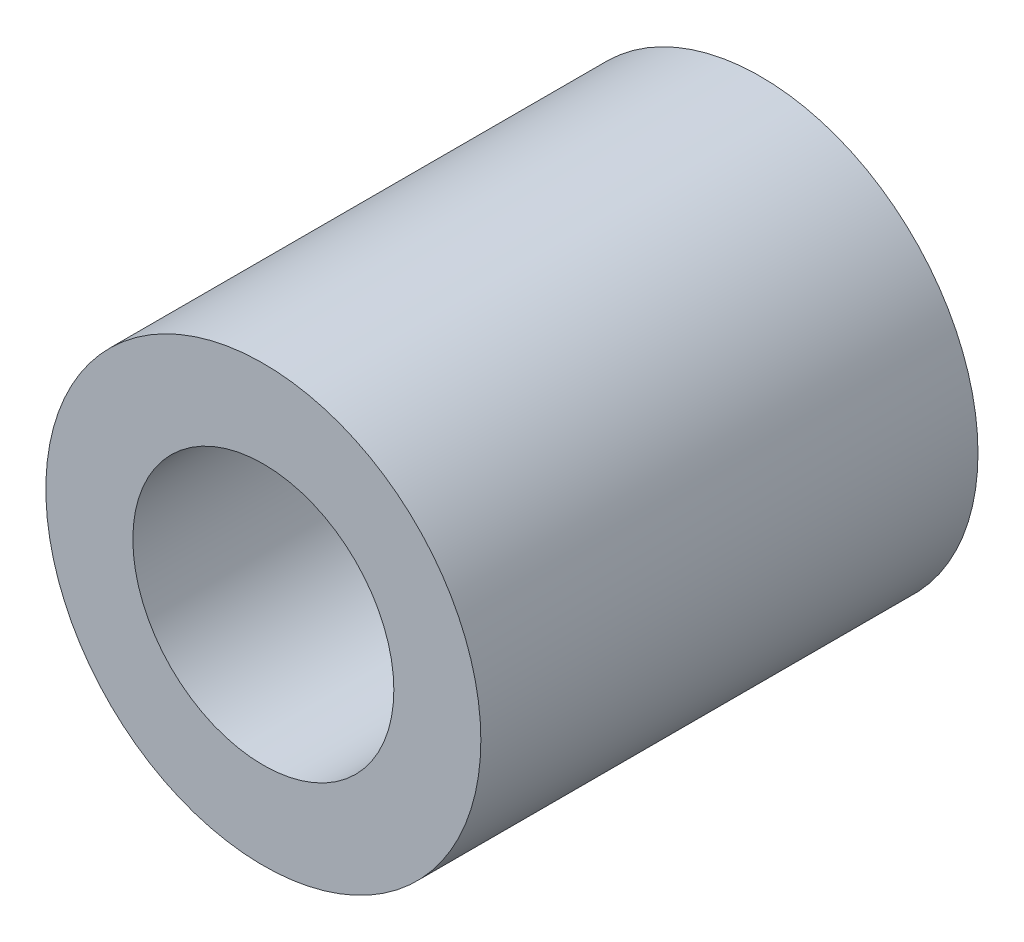
ISO-10303-21;
HEADER;
FILE_DESCRIPTION(('STEP AP214'),'2;1');
FILE_NAME('part.step','',(''),(''),'','','');
FILE_SCHEMA(('AUTOMOTIVE_DESIGN { 1 0 10303 214 1 1 1 1 }'));
ENDSEC;
DATA;
#1=APPLICATION_CONTEXT('core data for automotive mechanical design processes');
#2=APPLICATION_PROTOCOL_DEFINITION('international standard','automotive_design',2000,#1);
#3=PRODUCT_CONTEXT('',#1,'mechanical');
#4=PRODUCT('Part','Part','',(#3));
#5=PRODUCT_RELATED_PRODUCT_CATEGORY('part','',(#4));
#6=PRODUCT_DEFINITION_FORMATION('','',#4);
#7=PRODUCT_DEFINITION_CONTEXT('part definition',#1,'design');
#8=PRODUCT_DEFINITION('design','',#6,#7);
#9=PRODUCT_DEFINITION_SHAPE('','',#8);
#10=(LENGTH_UNIT() NAMED_UNIT(*) SI_UNIT(.MILLI.,.METRE.));
#11=(NAMED_UNIT(*) PLANE_ANGLE_UNIT() SI_UNIT($,.RADIAN.));
#12=(NAMED_UNIT(*) SI_UNIT($,.STERADIAN.) SOLID_ANGLE_UNIT());
#13=UNCERTAINTY_MEASURE_WITH_UNIT(LENGTH_MEASURE(1.E-05),#10,'distance_accuracy_value','');
#14=(GEOMETRIC_REPRESENTATION_CONTEXT(3) GLOBAL_UNCERTAINTY_ASSIGNED_CONTEXT((#13)) GLOBAL_UNIT_ASSIGNED_CONTEXT((#10,
#11,#12)) REPRESENTATION_CONTEXT('',''));
#15=CARTESIAN_POINT('',(0.,0.,0.));
#16=DIRECTION('',(0.,0.,1.));
#17=DIRECTION('',(1.,0.,0.));
#18=AXIS2_PLACEMENT_3D('',#15,#16,#17);
#19=CARTESIAN_POINT('',(0.,0.,8.));
#20=DIRECTION('',(0.,0.,1.));
#21=DIRECTION('',(1.,0.,0.));
#22=AXIS2_PLACEMENT_3D('',#19,#20,#21);
#23=PLANE('',#22);
#24=CARTESIAN_POINT('',(0.,0.,8.));
#25=DIRECTION('',(0.,0.,1.));
#26=DIRECTION('',(1.,0.,0.));
#27=AXIS2_PLACEMENT_3D('',#24,#25,#26);
#28=CIRCLE('',#27,3.5);
#29=CARTESIAN_POINT('',(3.5,0.,8.));
#30=VERTEX_POINT('',#29);
#31=EDGE_CURVE('E10',#30,#30,#28,.T.);
#32=ORIENTED_EDGE('',*,*,#31,.T.);
#33=EDGE_LOOP('',(#32));
#34=FACE_BOUND('',#33,.T.);
#35=CARTESIAN_POINT('',(0.,0.,8.));
#36=DIRECTION('',(0.,0.,1.));
#37=DIRECTION('',(1.,0.,0.));
#38=AXIS2_PLACEMENT_3D('',#35,#36,#37);
#39=CIRCLE('',#38,2.1);
#40=CARTESIAN_POINT('',(2.1,0.,8.));
#41=VERTEX_POINT('',#40);
#42=EDGE_CURVE('E50',#41,#41,#39,.T.);
#43=ORIENTED_EDGE('',*,*,#42,.F.);
#44=EDGE_LOOP('',(#43));
#45=FACE_BOUND('',#44,.T.);
#46=ADVANCED_FACE('F37',(#34,#45),#23,.T.);
#47=CARTESIAN_POINT('',(0.,0.,0.));
#48=DIRECTION('',(0.,0.,1.));
#49=DIRECTION('',(1.,0.,0.));
#50=AXIS2_PLACEMENT_3D('',#47,#48,#49);
#51=PLANE('',#50);
#52=CARTESIAN_POINT('',(0.,0.,0.));
#53=DIRECTION('',(0.,0.,1.));
#54=DIRECTION('',(1.,0.,0.));
#55=AXIS2_PLACEMENT_3D('',#52,#53,#54);
#56=CIRCLE('',#55,3.5);
#57=CARTESIAN_POINT('',(3.5,0.,0.));
#58=VERTEX_POINT('',#57);
#59=EDGE_CURVE('E41',#58,#58,#56,.T.);
#60=ORIENTED_EDGE('',*,*,#59,.F.);
#61=EDGE_LOOP('',(#60));
#62=FACE_BOUND('',#61,.T.);
#63=CARTESIAN_POINT('',(0.,0.,0.));
#64=DIRECTION('',(0.,0.,1.));
#65=DIRECTION('',(1.,0.,0.));
#66=AXIS2_PLACEMENT_3D('',#63,#64,#65);
#67=CIRCLE('',#66,2.1);
#68=CARTESIAN_POINT('',(2.1,0.,0.));
#69=VERTEX_POINT('',#68);
#70=EDGE_CURVE('E52',#69,#69,#67,.T.);
#71=ORIENTED_EDGE('',*,*,#70,.T.);
#72=EDGE_LOOP('',(#71));
#73=FACE_BOUND('',#72,.T.);
#74=ADVANCED_FACE('F64',(#62,#73),#51,.F.);
#75=CARTESIAN_POINT('',(0.,0.,8.));
#76=DIRECTION('',(0.,0.,-1.));
#77=DIRECTION('',(-1.,0.,0.));
#78=AXIS2_PLACEMENT_3D('',#75,#76,#77);
#79=CYLINDRICAL_SURFACE('',#78,3.5);
#80=ORIENTED_EDGE('',*,*,#31,.F.);
#81=EDGE_LOOP('',(#80));
#82=FACE_BOUND('',#81,.T.);
#83=ORIENTED_EDGE('',*,*,#59,.T.);
#84=EDGE_LOOP('',(#83));
#85=FACE_BOUND('',#84,.T.);
#86=ADVANCED_FACE('F39',(#82,#85),#79,.T.);
#87=CARTESIAN_POINT('',(0.,0.,8.));
#88=DIRECTION('',(0.,0.,-1.));
#89=DIRECTION('',(-1.,0.,0.));
#90=AXIS2_PLACEMENT_3D('',#87,#88,#89);
#91=CYLINDRICAL_SURFACE('',#90,2.1);
#92=ORIENTED_EDGE('',*,*,#42,.T.);
#93=EDGE_LOOP('',(#92));
#94=FACE_BOUND('',#93,.T.);
#95=ORIENTED_EDGE('',*,*,#70,.F.);
#96=EDGE_LOOP('',(#95));
#97=FACE_BOUND('',#96,.T.);
#98=ADVANCED_FACE('F60',(#94,#97),#91,.F.);
#99=CLOSED_SHELL('',(#46,#74,#86,#98));
#100=MANIFOLD_SOLID_BREP('B2',#99);
#101=ADVANCED_BREP_SHAPE_REPRESENTATION('',(#18,#100),#14);
#102=SHAPE_DEFINITION_REPRESENTATION(#9,#101);
ENDSEC;
END-ISO-10303-21;
